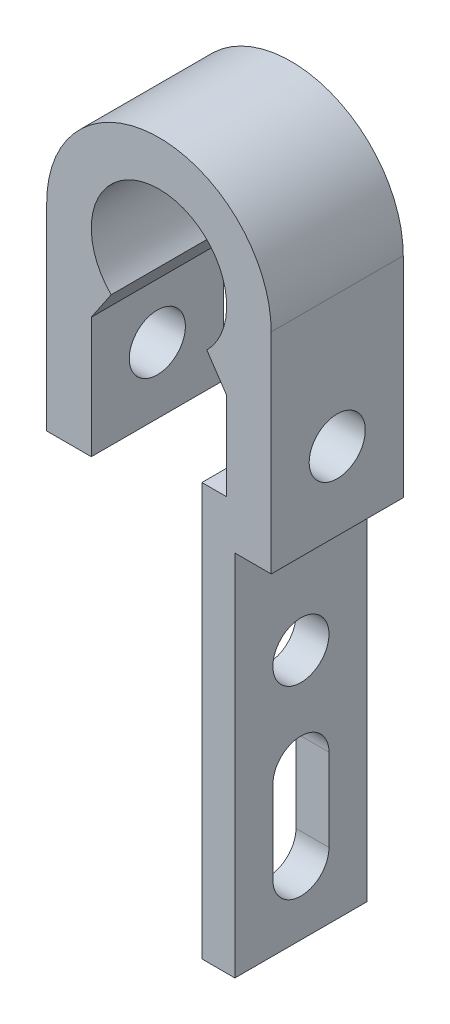
ISO-10303-21;
HEADER;
FILE_DESCRIPTION(('STEP AP214'),'2;1');
FILE_NAME('part.step','',(''),(''),'','','');
FILE_SCHEMA(('AUTOMOTIVE_DESIGN { 1 0 10303 214 1 1 1 1 }'));
ENDSEC;
DATA;
#1=APPLICATION_CONTEXT('core data for automotive mechanical design processes');
#2=APPLICATION_PROTOCOL_DEFINITION('international standard','automotive_design',2000,#1);
#3=PRODUCT_CONTEXT('',#1,'mechanical');
#4=PRODUCT('Part','Part','',(#3));
#5=PRODUCT_RELATED_PRODUCT_CATEGORY('part','',(#4));
#6=PRODUCT_DEFINITION_FORMATION('','',#4);
#7=PRODUCT_DEFINITION_CONTEXT('part definition',#1,'design');
#8=PRODUCT_DEFINITION('design','',#6,#7);
#9=PRODUCT_DEFINITION_SHAPE('','',#8);
#10=(LENGTH_UNIT() NAMED_UNIT(*) SI_UNIT(.MILLI.,.METRE.));
#11=(NAMED_UNIT(*) PLANE_ANGLE_UNIT() SI_UNIT($,.RADIAN.));
#12=(NAMED_UNIT(*) SI_UNIT($,.STERADIAN.) SOLID_ANGLE_UNIT());
#13=UNCERTAINTY_MEASURE_WITH_UNIT(LENGTH_MEASURE(1.E-05),#10,'distance_accuracy_value','');
#14=(GEOMETRIC_REPRESENTATION_CONTEXT(3) GLOBAL_UNCERTAINTY_ASSIGNED_CONTEXT((#13)) GLOBAL_UNIT_ASSIGNED_CONTEXT((#10,
#11,#12)) REPRESENTATION_CONTEXT('',''));
#15=CARTESIAN_POINT('',(0.,0.,0.));
#16=DIRECTION('',(0.,0.,1.));
#17=DIRECTION('',(1.,0.,0.));
#18=AXIS2_PLACEMENT_3D('',#15,#16,#17);
#19=CARTESIAN_POINT('',(-4.1,-12.,8.));
#20=DIRECTION('',(-1.,0.,0.));
#21=DIRECTION('',(0.,0.,1.));
#22=AXIS2_PLACEMENT_3D('',#19,#20,#21);
#23=PLANE('',#22);
#24=CARTESIAN_POINT('',(-4.1,-8.,4.));
#25=DIRECTION('',(-1.,0.,0.));
#26=DIRECTION('',(0.,0.,1.));
#27=AXIS2_PLACEMENT_3D('',#24,#25,#26);
#28=CIRCLE('',#27,1.7);
#29=CARTESIAN_POINT('',(-4.1,-8.,5.7));
#30=VERTEX_POINT('',#29);
#31=EDGE_CURVE('E251',#30,#30,#28,.T.);
#32=ORIENTED_EDGE('',*,*,#31,.T.);
#33=EDGE_LOOP('',(#32));
#34=FACE_BOUND('',#33,.T.);
#35=DIRECTION('',(0.,1.,0.));
#36=VECTOR('',#35,1.);
#37=CARTESIAN_POINT('',(-4.1,-12.,0.));
#38=LINE('',#37,#36);
#39=CARTESIAN_POINT('',(-4.1,-12.,0.));
#40=VERTEX_POINT('',#39);
#41=CARTESIAN_POINT('',(-4.1,-4.67694508196814,0.));
#42=VERTEX_POINT('',#41);
#43=EDGE_CURVE('E248',#40,#42,#38,.T.);
#44=ORIENTED_EDGE('',*,*,#43,.T.);
#45=DIRECTION('',(0.,0.,-1.));
#46=VECTOR('',#45,1.);
#47=CARTESIAN_POINT('',(-4.1,-4.67694508196814,8.));
#48=LINE('',#47,#46);
#49=CARTESIAN_POINT('',(-4.1,-4.67694508196814,8.));
#50=VERTEX_POINT('',#49);
#51=EDGE_CURVE('E160',#50,#42,#48,.T.);
#52=ORIENTED_EDGE('',*,*,#51,.F.);
#53=DIRECTION('',(0.,1.,0.));
#54=VECTOR('',#53,1.);
#55=CARTESIAN_POINT('',(-4.1,-12.,8.));
#56=LINE('',#55,#54);
#57=CARTESIAN_POINT('',(-4.1,-12.,8.));
#58=VERTEX_POINT('',#57);
#59=EDGE_CURVE('E223',#58,#50,#56,.T.);
#60=ORIENTED_EDGE('',*,*,#59,.F.);
#61=DIRECTION('',(0.,0.,-1.));
#62=VECTOR('',#61,1.);
#63=CARTESIAN_POINT('',(-4.1,-12.,8.));
#64=LINE('',#63,#62);
#65=EDGE_CURVE('E217',#58,#40,#64,.T.);
#66=ORIENTED_EDGE('',*,*,#65,.T.);
#67=EDGE_LOOP('',(#44,#52,#60,#66));
#68=FACE_BOUND('',#67,.T.);
#69=ADVANCED_FACE('F33',(#34,#68),#23,.F.);
#70=CARTESIAN_POINT('',(-2.89913780286485,-2.89913780286484,8.));
#71=DIRECTION('',(-0.828666573006495,0.559742539728465,0.));
#72=DIRECTION('',(-0.559742539728465,-0.828666573006495,0.));
#73=AXIS2_PLACEMENT_3D('',#70,#71,#72);
#74=PLANE('',#73);
#75=DIRECTION('',(0.559742539728465,0.828666573006495,0.));
#76=VECTOR('',#75,1.);
#77=CARTESIAN_POINT('',(-2.89913780286485,-2.89913780286484,0.));
#78=LINE('',#77,#76);
#79=CARTESIAN_POINT('',(-2.89913780286485,-2.89913780286484,0.));
#80=VERTEX_POINT('',#79);
#81=EDGE_CURVE('E246',#42,#80,#78,.T.);
#82=ORIENTED_EDGE('',*,*,#81,.T.);
#83=DIRECTION('',(0.,0.,-1.));
#84=VECTOR('',#83,1.);
#85=CARTESIAN_POINT('',(-2.89913780286485,-2.89913780286484,8.));
#86=LINE('',#85,#84);
#87=CARTESIAN_POINT('',(-2.89913780286485,-2.89913780286484,8.));
#88=VERTEX_POINT('',#87);
#89=EDGE_CURVE('E181',#88,#80,#86,.T.);
#90=ORIENTED_EDGE('',*,*,#89,.F.);
#91=DIRECTION('',(0.559742539728465,0.828666573006495,0.));
#92=VECTOR('',#91,1.);
#93=CARTESIAN_POINT('',(-2.89913780286485,-2.89913780286484,8.));
#94=LINE('',#93,#92);
#95=EDGE_CURVE('E275',#50,#88,#94,.T.);
#96=ORIENTED_EDGE('',*,*,#95,.F.);
#97=ORIENTED_EDGE('',*,*,#51,.T.);
#98=EDGE_LOOP('',(#82,#90,#96,#97));
#99=FACE_BOUND('',#98,.T.);
#100=ADVANCED_FACE('F323',(#99),#74,.F.);
#101=CARTESIAN_POINT('',(0.,0.,8.));
#102=DIRECTION('',(0.,0.,-1.));
#103=DIRECTION('',(-1.,0.,0.));
#104=AXIS2_PLACEMENT_3D('',#101,#102,#103);
#105=CYLINDRICAL_SURFACE('',#104,4.1);
#106=CARTESIAN_POINT('',(0.,0.,0.));
#107=DIRECTION('',(0.,0.,-1.));
#108=DIRECTION('',(-1.,0.,0.));
#109=AXIS2_PLACEMENT_3D('',#106,#107,#108);
#110=CIRCLE('',#109,4.1);
#111=CARTESIAN_POINT('',(2.89913780286485,-2.89913780286484,0.));
#112=VERTEX_POINT('',#111);
#113=EDGE_CURVE('E244',#80,#112,#110,.T.);
#114=ORIENTED_EDGE('',*,*,#113,.T.);
#115=DIRECTION('',(0.,0.,-1.));
#116=VECTOR('',#115,1.);
#117=CARTESIAN_POINT('',(2.89913780286485,-2.89913780286484,8.));
#118=LINE('',#117,#116);
#119=CARTESIAN_POINT('',(2.89913780286485,-2.89913780286484,8.));
#120=VERTEX_POINT('',#119);
#121=EDGE_CURVE('E184',#120,#112,#118,.T.);
#122=ORIENTED_EDGE('',*,*,#121,.F.);
#123=CARTESIAN_POINT('',(0.,0.,8.));
#124=DIRECTION('',(0.,0.,-1.));
#125=DIRECTION('',(-1.,0.,0.));
#126=AXIS2_PLACEMENT_3D('',#123,#124,#125);
#127=CIRCLE('',#126,4.1);
#128=EDGE_CURVE('E273',#88,#120,#127,.T.);
#129=ORIENTED_EDGE('',*,*,#128,.F.);
#130=ORIENTED_EDGE('',*,*,#89,.T.);
#131=EDGE_LOOP('',(#114,#122,#129,#130));
#132=FACE_BOUND('',#131,.T.);
#133=ADVANCED_FACE('F328',(#132),#105,.F.);
#134=CARTESIAN_POINT('',(4.1,-4.67694508196814,8.));
#135=DIRECTION('',(0.828666573006494,0.559742539728465,0.));
#136=DIRECTION('',(-0.559742539728465,0.828666573006494,0.));
#137=AXIS2_PLACEMENT_3D('',#134,#135,#136);
#138=PLANE('',#137);
#139=DIRECTION('',(0.559742539728465,-0.828666573006494,0.));
#140=VECTOR('',#139,1.);
#141=CARTESIAN_POINT('',(4.1,-4.67694508196814,0.));
#142=LINE('',#141,#140);
#143=CARTESIAN_POINT('',(4.1,-4.67694508196814,0.));
#144=VERTEX_POINT('',#143);
#145=EDGE_CURVE('E242',#112,#144,#142,.T.);
#146=ORIENTED_EDGE('',*,*,#145,.T.);
#147=DIRECTION('',(0.,0.,-1.));
#148=VECTOR('',#147,1.);
#149=CARTESIAN_POINT('',(4.1,-4.67694508196814,8.));
#150=LINE('',#149,#148);
#151=CARTESIAN_POINT('',(4.1,-4.67694508196814,8.));
#152=VERTEX_POINT('',#151);
#153=EDGE_CURVE('E187',#152,#144,#150,.T.);
#154=ORIENTED_EDGE('',*,*,#153,.F.);
#155=DIRECTION('',(0.559742539728465,-0.828666573006494,0.));
#156=VECTOR('',#155,1.);
#157=CARTESIAN_POINT('',(4.1,-4.67694508196814,8.));
#158=LINE('',#157,#156);
#159=EDGE_CURVE('E271',#120,#152,#158,.T.);
#160=ORIENTED_EDGE('',*,*,#159,.F.);
#161=ORIENTED_EDGE('',*,*,#121,.T.);
#162=EDGE_LOOP('',(#146,#154,#160,#161));
#163=FACE_BOUND('',#162,.T.);
#164=ADVANCED_FACE('F392',(#163),#138,.F.);
#165=CARTESIAN_POINT('',(4.1,-4.67694508196814,8.));
#166=DIRECTION('',(1.,0.,0.));
#167=DIRECTION('',(0.,1.,0.));
#168=AXIS2_PLACEMENT_3D('',#165,#166,#167);
#169=PLANE('',#168);
#170=CARTESIAN_POINT('',(4.1,-8.,4.));
#171=DIRECTION('',(1.,0.,0.));
#172=DIRECTION('',(0.,1.,0.));
#173=AXIS2_PLACEMENT_3D('',#170,#171,#172);
#174=CIRCLE('',#173,1.7);
#175=CARTESIAN_POINT('',(4.1,-6.3,4.));
#176=VERTEX_POINT('',#175);
#177=EDGE_CURVE('E281',#176,#176,#174,.T.);
#178=ORIENTED_EDGE('',*,*,#177,.T.);
#179=EDGE_LOOP('',(#178));
#180=FACE_BOUND('',#179,.T.);
#181=DIRECTION('',(0.,-1.,0.));
#182=VECTOR('',#181,1.);
#183=CARTESIAN_POINT('',(4.1,-4.67694508196814,0.));
#184=LINE('',#183,#182);
#185=CARTESIAN_POINT('',(4.1,-10.,0.));
#186=VERTEX_POINT('',#185);
#187=EDGE_CURVE('E240',#144,#186,#184,.T.);
#188=ORIENTED_EDGE('',*,*,#187,.T.);
#189=DIRECTION('',(0.,0.,-1.));
#190=VECTOR('',#189,1.);
#191=CARTESIAN_POINT('',(4.1,-10.,8.));
#192=LINE('',#191,#190);
#193=CARTESIAN_POINT('',(4.1,-10.,8.));
#194=VERTEX_POINT('',#193);
#195=EDGE_CURVE('E190',#194,#186,#192,.T.);
#196=ORIENTED_EDGE('',*,*,#195,.F.);
#197=DIRECTION('',(0.,-1.,0.));
#198=VECTOR('',#197,1.);
#199=CARTESIAN_POINT('',(4.1,-4.67694508196814,8.));
#200=LINE('',#199,#198);
#201=EDGE_CURVE('E269',#152,#194,#200,.T.);
#202=ORIENTED_EDGE('',*,*,#201,.F.);
#203=ORIENTED_EDGE('',*,*,#153,.T.);
#204=EDGE_LOOP('',(#188,#196,#202,#203));
#205=FACE_BOUND('',#204,.T.);
#206=ADVANCED_FACE('F388',(#180,#205),#169,.F.);
#207=CARTESIAN_POINT('',(4.1,-10.,8.));
#208=DIRECTION('',(0.,-1.,0.));
#209=DIRECTION('',(0.,0.,-1.));
#210=AXIS2_PLACEMENT_3D('',#207,#208,#209);
#211=PLANE('',#210);
#212=DIRECTION('',(-1.,0.,0.));
#213=VECTOR('',#212,1.);
#214=CARTESIAN_POINT('',(4.1,-10.,0.));
#215=LINE('',#214,#213);
#216=CARTESIAN_POINT('',(2.6,-10.,0.));
#217=VERTEX_POINT('',#216);
#218=EDGE_CURVE('E238',#186,#217,#215,.T.);
#219=ORIENTED_EDGE('',*,*,#218,.T.);
#220=DIRECTION('',(0.,0.,-1.));
#221=VECTOR('',#220,1.);
#222=CARTESIAN_POINT('',(2.6,-10.,8.));
#223=LINE('',#222,#221);
#224=CARTESIAN_POINT('',(2.6,-10.,8.));
#225=VERTEX_POINT('',#224);
#226=EDGE_CURVE('E193',#225,#217,#223,.T.);
#227=ORIENTED_EDGE('',*,*,#226,.F.);
#228=DIRECTION('',(-1.,0.,0.));
#229=VECTOR('',#228,1.);
#230=CARTESIAN_POINT('',(4.1,-10.,8.));
#231=LINE('',#230,#229);
#232=EDGE_CURVE('E267',#194,#225,#231,.T.);
#233=ORIENTED_EDGE('',*,*,#232,.F.);
#234=ORIENTED_EDGE('',*,*,#195,.T.);
#235=EDGE_LOOP('',(#219,#227,#233,#234));
#236=FACE_BOUND('',#235,.T.);
#237=ADVANCED_FACE('F383',(#236),#211,.F.);
#238=CARTESIAN_POINT('',(2.6,-10.,8.));
#239=DIRECTION('',(1.,0.,0.));
#240=DIRECTION('',(0.,1.,0.));
#241=AXIS2_PLACEMENT_3D('',#238,#239,#240);
#242=PLANE('',#241);
#243=CARTESIAN_POINT('',(2.6,-19.8,4.));
#244=DIRECTION('',(1.,0.,0.));
#245=DIRECTION('',(0.,1.,0.));
#246=AXIS2_PLACEMENT_3D('',#243,#244,#245);
#247=CIRCLE('',#246,1.7);
#248=CARTESIAN_POINT('',(2.6,-18.1,4.));
#249=VERTEX_POINT('',#248);
#250=EDGE_CURVE('E288',#249,#249,#247,.T.);
#251=ORIENTED_EDGE('',*,*,#250,.T.);
#252=EDGE_LOOP('',(#251));
#253=FACE_BOUND('',#252,.T.);
#254=DIRECTION('',(0.,1.,0.));
#255=VECTOR('',#254,1.);
#256=CARTESIAN_POINT('',(2.6,-10.,2.3));
#257=LINE('',#256,#255);
#258=CARTESIAN_POINT('',(2.6,-31.,2.3));
#259=VERTEX_POINT('',#258);
#260=CARTESIAN_POINT('',(2.6,-26.,2.3));
#261=VERTEX_POINT('',#260);
#262=EDGE_CURVE('E300',#259,#261,#257,.T.);
#263=ORIENTED_EDGE('',*,*,#262,.T.);
#264=CARTESIAN_POINT('',(2.6,-26.,4.));
#265=DIRECTION('',(1.,0.,0.));
#266=DIRECTION('',(0.,1.,0.));
#267=AXIS2_PLACEMENT_3D('',#264,#265,#266);
#268=CIRCLE('',#267,1.7);
#269=CARTESIAN_POINT('',(2.6,-26.,5.7));
#270=VERTEX_POINT('',#269);
#271=EDGE_CURVE('E167',#261,#270,#268,.T.);
#272=ORIENTED_EDGE('',*,*,#271,.T.);
#273=DIRECTION('',(0.,-1.,0.));
#274=VECTOR('',#273,1.);
#275=CARTESIAN_POINT('',(2.6,-10.,5.69999999999999));
#276=LINE('',#275,#274);
#277=CARTESIAN_POINT('',(2.6,-31.,5.7));
#278=VERTEX_POINT('',#277);
#279=EDGE_CURVE('E294',#270,#278,#276,.T.);
#280=ORIENTED_EDGE('',*,*,#279,.T.);
#281=CARTESIAN_POINT('',(2.6,-31.,4.));
#282=DIRECTION('',(1.,0.,0.));
#283=DIRECTION('',(0.,1.,0.));
#284=AXIS2_PLACEMENT_3D('',#281,#282,#283);
#285=CIRCLE('',#284,1.7);
#286=EDGE_CURVE('E297',#278,#259,#285,.T.);
#287=ORIENTED_EDGE('',*,*,#286,.T.);
#288=EDGE_LOOP('',(#263,#272,#280,#287));
#289=FACE_BOUND('',#288,.T.);
#290=DIRECTION('',(0.,-1.,0.));
#291=VECTOR('',#290,1.);
#292=CARTESIAN_POINT('',(2.6,-10.,0.));
#293=LINE('',#292,#291);
#294=CARTESIAN_POINT('',(2.6,-35.,0.));
#295=VERTEX_POINT('',#294);
#296=EDGE_CURVE('E236',#217,#295,#293,.T.);
#297=ORIENTED_EDGE('',*,*,#296,.T.);
#298=DIRECTION('',(0.,0.,-1.));
#299=VECTOR('',#298,1.);
#300=CARTESIAN_POINT('',(2.6,-35.,8.));
#301=LINE('',#300,#299);
#302=CARTESIAN_POINT('',(2.6,-35.,8.));
#303=VERTEX_POINT('',#302);
#304=EDGE_CURVE('E196',#303,#295,#301,.T.);
#305=ORIENTED_EDGE('',*,*,#304,.F.);
#306=DIRECTION('',(0.,-1.,0.));
#307=VECTOR('',#306,1.);
#308=CARTESIAN_POINT('',(2.6,-10.,8.));
#309=LINE('',#308,#307);
#310=EDGE_CURVE('E265',#225,#303,#309,.T.);
#311=ORIENTED_EDGE('',*,*,#310,.F.);
#312=ORIENTED_EDGE('',*,*,#226,.T.);
#313=EDGE_LOOP('',(#297,#305,#311,#312));
#314=FACE_BOUND('',#313,.T.);
#315=ADVANCED_FACE('F307',(#253,#289,#314),#242,.F.);
#316=CARTESIAN_POINT('',(2.6,-35.,8.));
#317=DIRECTION('',(0.,1.,0.));
#318=DIRECTION('',(0.,0.,1.));
#319=AXIS2_PLACEMENT_3D('',#316,#317,#318);
#320=PLANE('',#319);
#321=DIRECTION('',(1.,0.,0.));
#322=VECTOR('',#321,1.);
#323=CARTESIAN_POINT('',(2.6,-35.,0.));
#324=LINE('',#323,#322);
#325=CARTESIAN_POINT('',(4.6,-35.,0.));
#326=VERTEX_POINT('',#325);
#327=EDGE_CURVE('E234',#295,#326,#324,.T.);
#328=ORIENTED_EDGE('',*,*,#327,.T.);
#329=DIRECTION('',(0.,0.,-1.));
#330=VECTOR('',#329,1.);
#331=CARTESIAN_POINT('',(4.6,-35.,8.));
#332=LINE('',#331,#330);
#333=CARTESIAN_POINT('',(4.6,-35.,8.));
#334=VERTEX_POINT('',#333);
#335=EDGE_CURVE('E199',#334,#326,#332,.T.);
#336=ORIENTED_EDGE('',*,*,#335,.F.);
#337=DIRECTION('',(1.,0.,0.));
#338=VECTOR('',#337,1.);
#339=CARTESIAN_POINT('',(2.6,-35.,8.));
#340=LINE('',#339,#338);
#341=EDGE_CURVE('E263',#303,#334,#340,.T.);
#342=ORIENTED_EDGE('',*,*,#341,.F.);
#343=ORIENTED_EDGE('',*,*,#304,.T.);
#344=EDGE_LOOP('',(#328,#336,#342,#343));
#345=FACE_BOUND('',#344,.T.);
#346=ADVANCED_FACE('F376',(#345),#320,.F.);
#347=CARTESIAN_POINT('',(4.6,-12.7,8.));
#348=DIRECTION('',(-1.,0.,0.));
#349=DIRECTION('',(0.,-1.,0.));
#350=AXIS2_PLACEMENT_3D('',#347,#348,#349);
#351=PLANE('',#350);
#352=CARTESIAN_POINT('',(4.6,-19.8,4.));
#353=DIRECTION('',(-1.,0.,0.));
#354=DIRECTION('',(0.,-1.,0.));
#355=AXIS2_PLACEMENT_3D('',#352,#353,#354);
#356=CIRCLE('',#355,1.7);
#357=CARTESIAN_POINT('',(4.6,-21.5,4.));
#358=VERTEX_POINT('',#357);
#359=EDGE_CURVE('E36',#358,#358,#356,.T.);
#360=ORIENTED_EDGE('',*,*,#359,.T.);
#361=EDGE_LOOP('',(#360));
#362=FACE_BOUND('',#361,.T.);
#363=DIRECTION('',(0.,1.,0.));
#364=VECTOR('',#363,1.);
#365=CARTESIAN_POINT('',(4.6,-12.7,5.69999999999999));
#366=LINE('',#365,#364);
#367=CARTESIAN_POINT('',(4.6,-31.,5.7));
#368=VERTEX_POINT('',#367);
#369=CARTESIAN_POINT('',(4.6,-26.,5.7));
#370=VERTEX_POINT('',#369);
#371=EDGE_CURVE('E41',#368,#370,#366,.T.);
#372=ORIENTED_EDGE('',*,*,#371,.T.);
#373=CARTESIAN_POINT('',(4.6,-26.,4.));
#374=DIRECTION('',(-1.,0.,0.));
#375=DIRECTION('',(0.,-1.,0.));
#376=AXIS2_PLACEMENT_3D('',#373,#374,#375);
#377=CIRCLE('',#376,1.7);
#378=CARTESIAN_POINT('',(4.6,-26.,2.3));
#379=VERTEX_POINT('',#378);
#380=EDGE_CURVE('E11',#370,#379,#377,.T.);
#381=ORIENTED_EDGE('',*,*,#380,.T.);
#382=DIRECTION('',(0.,-1.,0.));
#383=VECTOR('',#382,1.);
#384=CARTESIAN_POINT('',(4.6,-12.7,2.3));
#385=LINE('',#384,#383);
#386=CARTESIAN_POINT('',(4.6,-31.,2.3));
#387=VERTEX_POINT('',#386);
#388=EDGE_CURVE('E155',#379,#387,#385,.T.);
#389=ORIENTED_EDGE('',*,*,#388,.T.);
#390=CARTESIAN_POINT('',(4.6,-31.,4.));
#391=DIRECTION('',(-1.,0.,0.));
#392=DIRECTION('',(0.,-1.,0.));
#393=AXIS2_PLACEMENT_3D('',#390,#391,#392);
#394=CIRCLE('',#393,1.7);
#395=EDGE_CURVE('E159',#387,#368,#394,.T.);
#396=ORIENTED_EDGE('',*,*,#395,.T.);
#397=EDGE_LOOP('',(#372,#381,#389,#396));
#398=FACE_BOUND('',#397,.T.);
#399=DIRECTION('',(0.,1.,0.));
#400=VECTOR('',#399,1.);
#401=CARTESIAN_POINT('',(4.6,-12.7,0.));
#402=LINE('',#401,#400);
#403=CARTESIAN_POINT('',(4.6,-12.7,0.));
#404=VERTEX_POINT('',#403);
#405=EDGE_CURVE('E232',#326,#404,#402,.T.);
#406=ORIENTED_EDGE('',*,*,#405,.T.);
#407=DIRECTION('',(0.,0.,-1.));
#408=VECTOR('',#407,1.);
#409=CARTESIAN_POINT('',(4.6,-12.7,8.));
#410=LINE('',#409,#408);
#411=CARTESIAN_POINT('',(4.6,-12.7,8.));
#412=VERTEX_POINT('',#411);
#413=EDGE_CURVE('E202',#412,#404,#410,.T.);
#414=ORIENTED_EDGE('',*,*,#413,.F.);
#415=DIRECTION('',(0.,1.,0.));
#416=VECTOR('',#415,1.);
#417=CARTESIAN_POINT('',(4.6,-12.7,8.));
#418=LINE('',#417,#416);
#419=EDGE_CURVE('E261',#334,#412,#418,.T.);
#420=ORIENTED_EDGE('',*,*,#419,.F.);
#421=ORIENTED_EDGE('',*,*,#335,.T.);
#422=EDGE_LOOP('',(#406,#414,#420,#421));
#423=FACE_BOUND('',#422,.T.);
#424=ADVANCED_FACE('F171',(#362,#398,#423),#351,.F.);
#425=CARTESIAN_POINT('',(6.8,-12.7,8.));
#426=DIRECTION('',(0.,1.,0.));
#427=DIRECTION('',(0.,0.,1.));
#428=AXIS2_PLACEMENT_3D('',#425,#426,#427);
#429=PLANE('',#428);
#430=DIRECTION('',(1.,0.,0.));
#431=VECTOR('',#430,1.);
#432=CARTESIAN_POINT('',(6.8,-12.7,0.));
#433=LINE('',#432,#431);
#434=CARTESIAN_POINT('',(6.8,-12.7,0.));
#435=VERTEX_POINT('',#434);
#436=EDGE_CURVE('E230',#404,#435,#433,.T.);
#437=ORIENTED_EDGE('',*,*,#436,.T.);
#438=DIRECTION('',(0.,0.,-1.));
#439=VECTOR('',#438,1.);
#440=CARTESIAN_POINT('',(6.8,-12.7,8.));
#441=LINE('',#440,#439);
#442=CARTESIAN_POINT('',(6.8,-12.7,8.));
#443=VERTEX_POINT('',#442);
#444=EDGE_CURVE('E205',#443,#435,#441,.T.);
#445=ORIENTED_EDGE('',*,*,#444,.F.);
#446=DIRECTION('',(1.,0.,0.));
#447=VECTOR('',#446,1.);
#448=CARTESIAN_POINT('',(6.8,-12.7,8.));
#449=LINE('',#448,#447);
#450=EDGE_CURVE('E259',#412,#443,#449,.T.);
#451=ORIENTED_EDGE('',*,*,#450,.F.);
#452=ORIENTED_EDGE('',*,*,#413,.T.);
#453=EDGE_LOOP('',(#437,#445,#451,#452));
#454=FACE_BOUND('',#453,.T.);
#455=ADVANCED_FACE('F367',(#454),#429,.F.);
#456=CARTESIAN_POINT('',(6.8,0.,8.));
#457=DIRECTION('',(-1.,0.,0.));
#458=DIRECTION('',(0.,0.,1.));
#459=AXIS2_PLACEMENT_3D('',#456,#457,#458);
#460=PLANE('',#459);
#461=CARTESIAN_POINT('',(6.8,-8.,4.));
#462=DIRECTION('',(-1.,0.,0.));
#463=DIRECTION('',(0.,0.,1.));
#464=AXIS2_PLACEMENT_3D('',#461,#462,#463);
#465=CIRCLE('',#464,1.7);
#466=CARTESIAN_POINT('',(6.8,-8.,5.7));
#467=VERTEX_POINT('',#466);
#468=EDGE_CURVE('E284',#467,#467,#465,.T.);
#469=ORIENTED_EDGE('',*,*,#468,.T.);
#470=EDGE_LOOP('',(#469));
#471=FACE_BOUND('',#470,.T.);
#472=DIRECTION('',(0.,1.,0.));
#473=VECTOR('',#472,1.);
#474=CARTESIAN_POINT('',(6.8,0.,0.));
#475=LINE('',#474,#473);
#476=CARTESIAN_POINT('',(6.8,0.,0.));
#477=VERTEX_POINT('',#476);
#478=EDGE_CURVE('E228',#435,#477,#475,.T.);
#479=ORIENTED_EDGE('',*,*,#478,.T.);
#480=DIRECTION('',(0.,0.,-1.));
#481=VECTOR('',#480,1.);
#482=CARTESIAN_POINT('',(6.8,0.,8.));
#483=LINE('',#482,#481);
#484=CARTESIAN_POINT('',(6.8,0.,8.));
#485=VERTEX_POINT('',#484);
#486=EDGE_CURVE('E208',#485,#477,#483,.T.);
#487=ORIENTED_EDGE('',*,*,#486,.F.);
#488=DIRECTION('',(0.,1.,0.));
#489=VECTOR('',#488,1.);
#490=CARTESIAN_POINT('',(6.8,0.,8.));
#491=LINE('',#490,#489);
#492=EDGE_CURVE('E257',#443,#485,#491,.T.);
#493=ORIENTED_EDGE('',*,*,#492,.F.);
#494=ORIENTED_EDGE('',*,*,#444,.T.);
#495=EDGE_LOOP('',(#479,#487,#493,#494));
#496=FACE_BOUND('',#495,.T.);
#497=ADVANCED_FACE('F363',(#471,#496),#460,.F.);
#498=CARTESIAN_POINT('',(0.,0.,8.));
#499=DIRECTION('',(0.,0.,-1.));
#500=DIRECTION('',(-1.,0.,0.));
#501=AXIS2_PLACEMENT_3D('',#498,#499,#500);
#502=CYLINDRICAL_SURFACE('',#501,6.8);
#503=CARTESIAN_POINT('',(0.,0.,0.));
#504=DIRECTION('',(0.,0.,1.));
#505=DIRECTION('',(-1.,0.,0.));
#506=AXIS2_PLACEMENT_3D('',#503,#504,#505);
#507=CIRCLE('',#506,6.8);
#508=CARTESIAN_POINT('',(-6.8,0.,0.));
#509=VERTEX_POINT('',#508);
#510=EDGE_CURVE('E226',#477,#509,#507,.T.);
#511=ORIENTED_EDGE('',*,*,#510,.T.);
#512=DIRECTION('',(0.,0.,-1.));
#513=VECTOR('',#512,1.);
#514=CARTESIAN_POINT('',(-6.8,0.,8.));
#515=LINE('',#514,#513);
#516=CARTESIAN_POINT('',(-6.8,0.,8.));
#517=VERTEX_POINT('',#516);
#518=EDGE_CURVE('E211',#517,#509,#515,.T.);
#519=ORIENTED_EDGE('',*,*,#518,.F.);
#520=CARTESIAN_POINT('',(0.,0.,8.));
#521=DIRECTION('',(0.,0.,1.));
#522=DIRECTION('',(-1.,0.,0.));
#523=AXIS2_PLACEMENT_3D('',#520,#521,#522);
#524=CIRCLE('',#523,6.8);
#525=EDGE_CURVE('E255',#485,#517,#524,.T.);
#526=ORIENTED_EDGE('',*,*,#525,.F.);
#527=ORIENTED_EDGE('',*,*,#486,.T.);
#528=EDGE_LOOP('',(#511,#519,#526,#527));
#529=FACE_BOUND('',#528,.T.);
#530=ADVANCED_FACE('F358',(#529),#502,.T.);
#531=CARTESIAN_POINT('',(-6.8,-12.,8.));
#532=DIRECTION('',(1.,0.,0.));
#533=DIRECTION('',(0.,1.,0.));
#534=AXIS2_PLACEMENT_3D('',#531,#532,#533);
#535=PLANE('',#534);
#536=CARTESIAN_POINT('',(-6.8,-8.,4.));
#537=DIRECTION('',(-1.,0.,0.));
#538=DIRECTION('',(0.,0.,1.));
#539=AXIS2_PLACEMENT_3D('',#536,#537,#538);
#540=CIRCLE('',#539,1.7);
#541=CARTESIAN_POINT('',(-6.8,-8.,5.7));
#542=VERTEX_POINT('',#541);
#543=EDGE_CURVE('E285',#542,#542,#540,.T.);
#544=ORIENTED_EDGE('',*,*,#543,.F.);
#545=EDGE_LOOP('',(#544));
#546=FACE_BOUND('',#545,.T.);
#547=DIRECTION('',(0.,-1.,0.));
#548=VECTOR('',#547,1.);
#549=CARTESIAN_POINT('',(-6.8,-12.,0.));
#550=LINE('',#549,#548);
#551=CARTESIAN_POINT('',(-6.8,-12.,0.));
#552=VERTEX_POINT('',#551);
#553=EDGE_CURVE('E224',#509,#552,#550,.T.);
#554=ORIENTED_EDGE('',*,*,#553,.T.);
#555=DIRECTION('',(0.,0.,-1.));
#556=VECTOR('',#555,1.);
#557=CARTESIAN_POINT('',(-6.8,-12.,8.));
#558=LINE('',#557,#556);
#559=CARTESIAN_POINT('',(-6.8,-12.,8.));
#560=VERTEX_POINT('',#559);
#561=EDGE_CURVE('E214',#560,#552,#558,.T.);
#562=ORIENTED_EDGE('',*,*,#561,.F.);
#563=DIRECTION('',(0.,-1.,0.));
#564=VECTOR('',#563,1.);
#565=CARTESIAN_POINT('',(-6.8,-12.,8.));
#566=LINE('',#565,#564);
#567=EDGE_CURVE('E253',#517,#560,#566,.T.);
#568=ORIENTED_EDGE('',*,*,#567,.F.);
#569=ORIENTED_EDGE('',*,*,#518,.T.);
#570=EDGE_LOOP('',(#554,#562,#568,#569));
#571=FACE_BOUND('',#570,.T.);
#572=ADVANCED_FACE('F352',(#546,#571),#535,.F.);
#573=CARTESIAN_POINT('',(-6.8,-12.,8.));
#574=DIRECTION('',(0.,1.,0.));
#575=DIRECTION('',(0.,0.,1.));
#576=AXIS2_PLACEMENT_3D('',#573,#574,#575);
#577=PLANE('',#576);
#578=DIRECTION('',(1.,0.,0.));
#579=VECTOR('',#578,1.);
#580=CARTESIAN_POINT('',(-6.8,-12.,0.));
#581=LINE('',#580,#579);
#582=EDGE_CURVE('E221',#552,#40,#581,.T.);
#583=ORIENTED_EDGE('',*,*,#582,.T.);
#584=ORIENTED_EDGE('',*,*,#65,.F.);
#585=DIRECTION('',(1.,0.,0.));
#586=VECTOR('',#585,1.);
#587=CARTESIAN_POINT('',(-6.8,-12.,8.));
#588=LINE('',#587,#586);
#589=EDGE_CURVE('E220',#560,#58,#588,.T.);
#590=ORIENTED_EDGE('',*,*,#589,.F.);
#591=ORIENTED_EDGE('',*,*,#561,.T.);
#592=EDGE_LOOP('',(#583,#584,#590,#591));
#593=FACE_BOUND('',#592,.T.);
#594=ADVANCED_FACE('F350',(#593),#577,.F.);
#595=CARTESIAN_POINT('',(0.,0.,8.));
#596=DIRECTION('',(0.,0.,-1.));
#597=DIRECTION('',(-1.,0.,0.));
#598=AXIS2_PLACEMENT_3D('',#595,#596,#597);
#599=PLANE('',#598);
#600=ORIENTED_EDGE('',*,*,#59,.T.);
#601=ORIENTED_EDGE('',*,*,#95,.T.);
#602=ORIENTED_EDGE('',*,*,#128,.T.);
#603=ORIENTED_EDGE('',*,*,#159,.T.);
#604=ORIENTED_EDGE('',*,*,#201,.T.);
#605=ORIENTED_EDGE('',*,*,#232,.T.);
#606=ORIENTED_EDGE('',*,*,#310,.T.);
#607=ORIENTED_EDGE('',*,*,#341,.T.);
#608=ORIENTED_EDGE('',*,*,#419,.T.);
#609=ORIENTED_EDGE('',*,*,#450,.T.);
#610=ORIENTED_EDGE('',*,*,#492,.T.);
#611=ORIENTED_EDGE('',*,*,#525,.T.);
#612=ORIENTED_EDGE('',*,*,#567,.T.);
#613=ORIENTED_EDGE('',*,*,#589,.T.);
#614=EDGE_LOOP('',(#600,#601,#602,#603,#604,#605,#606,#607,#608,#609,#610,#611,#612,#613));
#615=FACE_BOUND('',#614,.T.);
#616=ADVANCED_FACE('F345',(#615),#599,.F.);
#617=CARTESIAN_POINT('',(0.,0.,0.));
#618=DIRECTION('',(0.,0.,-1.));
#619=DIRECTION('',(-1.,0.,0.));
#620=AXIS2_PLACEMENT_3D('',#617,#618,#619);
#621=PLANE('',#620);
#622=ORIENTED_EDGE('',*,*,#43,.F.);
#623=ORIENTED_EDGE('',*,*,#582,.F.);
#624=ORIENTED_EDGE('',*,*,#553,.F.);
#625=ORIENTED_EDGE('',*,*,#510,.F.);
#626=ORIENTED_EDGE('',*,*,#478,.F.);
#627=ORIENTED_EDGE('',*,*,#436,.F.);
#628=ORIENTED_EDGE('',*,*,#405,.F.);
#629=ORIENTED_EDGE('',*,*,#327,.F.);
#630=ORIENTED_EDGE('',*,*,#296,.F.);
#631=ORIENTED_EDGE('',*,*,#218,.F.);
#632=ORIENTED_EDGE('',*,*,#187,.F.);
#633=ORIENTED_EDGE('',*,*,#145,.F.);
#634=ORIENTED_EDGE('',*,*,#113,.F.);
#635=ORIENTED_EDGE('',*,*,#81,.F.);
#636=EDGE_LOOP('',(#622,#623,#624,#625,#626,#627,#628,#629,#630,#631,#632,#633,#634,#635));
#637=FACE_BOUND('',#636,.T.);
#638=ADVANCED_FACE('F338',(#637),#621,.T.);
#639=CARTESIAN_POINT('',(6.8,-8.,4.));
#640=DIRECTION('',(-1.,0.,0.));
#641=DIRECTION('',(0.,0.,1.));
#642=AXIS2_PLACEMENT_3D('',#639,#640,#641);
#643=CYLINDRICAL_SURFACE('',#642,1.7);
#644=ORIENTED_EDGE('',*,*,#543,.T.);
#645=EDGE_LOOP('',(#644));
#646=FACE_BOUND('',#645,.T.);
#647=ORIENTED_EDGE('',*,*,#31,.F.);
#648=EDGE_LOOP('',(#647));
#649=FACE_BOUND('',#648,.T.);
#650=ADVANCED_FACE('F429',(#646,#649),#643,.F.);
#651=ORIENTED_EDGE('',*,*,#468,.F.);
#652=EDGE_LOOP('',(#651));
#653=FACE_BOUND('',#652,.T.);
#654=ORIENTED_EDGE('',*,*,#177,.F.);
#655=EDGE_LOOP('',(#654));
#656=FACE_BOUND('',#655,.T.);
#657=ADVANCED_FACE('F319',(#653,#656),#643,.F.);
#658=CARTESIAN_POINT('',(6.8,-26.,4.));
#659=DIRECTION('',(-1.,0.,0.));
#660=DIRECTION('',(0.,0.,1.));
#661=AXIS2_PLACEMENT_3D('',#658,#659,#660);
#662=CYLINDRICAL_SURFACE('',#661,1.7);
#663=DIRECTION('',(-1.,0.,0.));
#664=VECTOR('',#663,1.);
#665=CARTESIAN_POINT('',(6.8,-26.,2.3));
#666=LINE('',#665,#664);
#667=EDGE_CURVE('E48',#379,#261,#666,.T.);
#668=ORIENTED_EDGE('',*,*,#667,.F.);
#669=ORIENTED_EDGE('',*,*,#380,.F.);
#670=DIRECTION('',(-1.,0.,0.));
#671=VECTOR('',#670,1.);
#672=CARTESIAN_POINT('',(6.8,-26.,5.7));
#673=LINE('',#672,#671);
#674=EDGE_CURVE('E301',#370,#270,#673,.T.);
#675=ORIENTED_EDGE('',*,*,#674,.T.);
#676=ORIENTED_EDGE('',*,*,#271,.F.);
#677=EDGE_LOOP('',(#668,#669,#675,#676));
#678=FACE_BOUND('',#677,.T.);
#679=ADVANCED_FACE('F163',(#678),#662,.F.);
#680=CARTESIAN_POINT('',(6.8,-26.,5.7));
#681=DIRECTION('',(0.,0.,1.));
#682=DIRECTION('',(0.,-1.,0.));
#683=AXIS2_PLACEMENT_3D('',#680,#681,#682);
#684=PLANE('',#683);
#685=ORIENTED_EDGE('',*,*,#674,.F.);
#686=ORIENTED_EDGE('',*,*,#371,.F.);
#687=DIRECTION('',(-1.,0.,0.));
#688=VECTOR('',#687,1.);
#689=CARTESIAN_POINT('',(6.8,-31.,5.7));
#690=LINE('',#689,#688);
#691=EDGE_CURVE('E304',#368,#278,#690,.T.);
#692=ORIENTED_EDGE('',*,*,#691,.T.);
#693=ORIENTED_EDGE('',*,*,#279,.F.);
#694=EDGE_LOOP('',(#685,#686,#692,#693));
#695=FACE_BOUND('',#694,.T.);
#696=ADVANCED_FACE('F311',(#695),#684,.F.);
#697=CARTESIAN_POINT('',(6.8,-31.,4.));
#698=DIRECTION('',(-1.,0.,0.));
#699=DIRECTION('',(0.,0.,1.));
#700=AXIS2_PLACEMENT_3D('',#697,#698,#699);
#701=CYLINDRICAL_SURFACE('',#700,1.7);
#702=ORIENTED_EDGE('',*,*,#691,.F.);
#703=ORIENTED_EDGE('',*,*,#395,.F.);
#704=DIRECTION('',(-1.,0.,0.));
#705=VECTOR('',#704,1.);
#706=CARTESIAN_POINT('',(6.8,-31.,2.3));
#707=LINE('',#706,#705);
#708=EDGE_CURVE('E53',#387,#259,#707,.T.);
#709=ORIENTED_EDGE('',*,*,#708,.T.);
#710=ORIENTED_EDGE('',*,*,#286,.F.);
#711=EDGE_LOOP('',(#702,#703,#709,#710));
#712=FACE_BOUND('',#711,.T.);
#713=ADVANCED_FACE('F310',(#712),#701,.F.);
#714=CARTESIAN_POINT('',(6.8,-26.,2.3));
#715=DIRECTION('',(0.,0.,-1.));
#716=DIRECTION('',(0.,1.,0.));
#717=AXIS2_PLACEMENT_3D('',#714,#715,#716);
#718=PLANE('',#717);
#719=ORIENTED_EDGE('',*,*,#708,.F.);
#720=ORIENTED_EDGE('',*,*,#388,.F.);
#721=ORIENTED_EDGE('',*,*,#667,.T.);
#722=ORIENTED_EDGE('',*,*,#262,.F.);
#723=EDGE_LOOP('',(#719,#720,#721,#722));
#724=FACE_BOUND('',#723,.T.);
#725=ADVANCED_FACE('F156',(#724),#718,.F.);
#726=CARTESIAN_POINT('',(6.8,-19.8,4.));
#727=DIRECTION('',(-1.,0.,0.));
#728=DIRECTION('',(0.,0.,1.));
#729=AXIS2_PLACEMENT_3D('',#726,#727,#728);
#730=CYLINDRICAL_SURFACE('',#729,1.7);
#731=ORIENTED_EDGE('',*,*,#359,.F.);
#732=EDGE_LOOP('',(#731));
#733=FACE_BOUND('',#732,.T.);
#734=ORIENTED_EDGE('',*,*,#250,.F.);
#735=EDGE_LOOP('',(#734));
#736=FACE_BOUND('',#735,.T.);
#737=ADVANCED_FACE('F436',(#733,#736),#730,.F.);
#738=CLOSED_SHELL('',(#69,#100,#133,#164,#206,#237,#315,#346,#424,#455,#497,#530,#572,#594,#616,
#638,#650,#657,#679,#696,#713,#725,#737));
#739=MANIFOLD_SOLID_BREP('B2',#738);
#740=ADVANCED_BREP_SHAPE_REPRESENTATION('',(#18,#739),#14);
#741=SHAPE_DEFINITION_REPRESENTATION(#9,#740);
ENDSEC;
END-ISO-10303-21;
